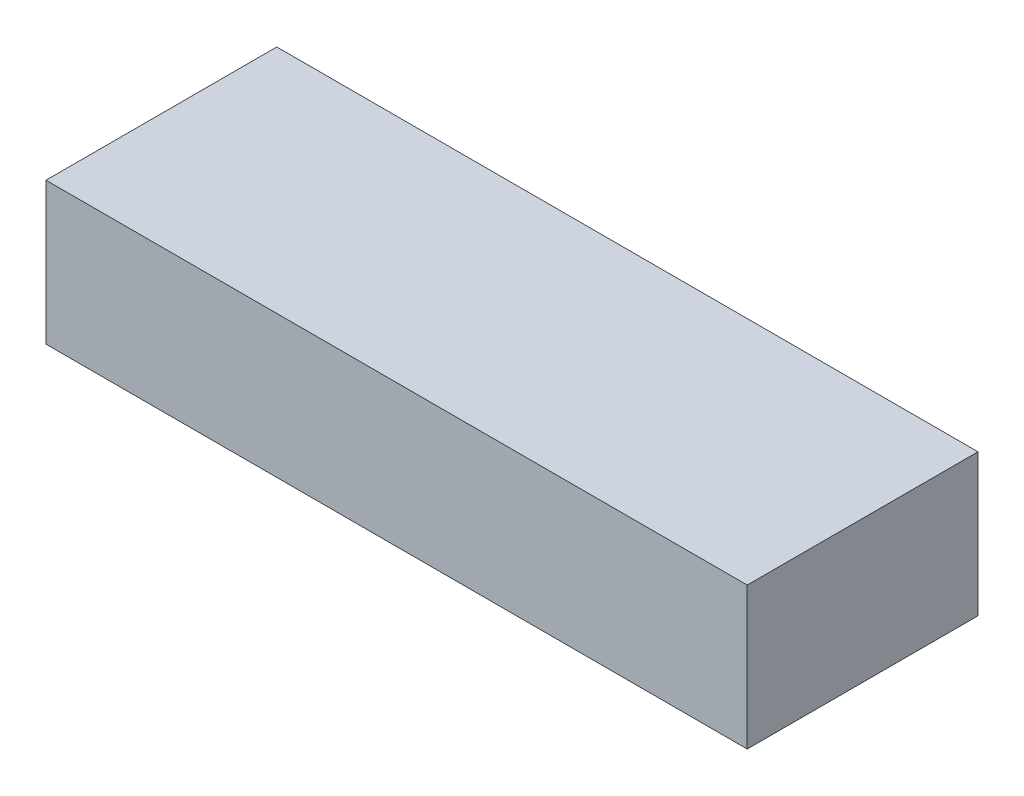
ISO-10303-21;
HEADER;
FILE_DESCRIPTION(('STEP AP214'),'2;1');
FILE_NAME('part.step','',(''),(''),'','','');
FILE_SCHEMA(('AUTOMOTIVE_DESIGN { 1 0 10303 214 1 1 1 1 }'));
ENDSEC;
DATA;
#1=APPLICATION_CONTEXT('core data for automotive mechanical design processes');
#2=APPLICATION_PROTOCOL_DEFINITION('international standard','automotive_design',2000,#1);
#3=PRODUCT_CONTEXT('',#1,'mechanical');
#4=PRODUCT('Part','Part','',(#3));
#5=PRODUCT_RELATED_PRODUCT_CATEGORY('part','',(#4));
#6=PRODUCT_DEFINITION_FORMATION('','',#4);
#7=PRODUCT_DEFINITION_CONTEXT('part definition',#1,'design');
#8=PRODUCT_DEFINITION('design','',#6,#7);
#9=PRODUCT_DEFINITION_SHAPE('','',#8);
#10=(LENGTH_UNIT() NAMED_UNIT(*) SI_UNIT(.MILLI.,.METRE.));
#11=(NAMED_UNIT(*) PLANE_ANGLE_UNIT() SI_UNIT($,.RADIAN.));
#12=(NAMED_UNIT(*) SI_UNIT($,.STERADIAN.) SOLID_ANGLE_UNIT());
#13=UNCERTAINTY_MEASURE_WITH_UNIT(LENGTH_MEASURE(1.E-05),#10,'distance_accuracy_value','');
#14=(GEOMETRIC_REPRESENTATION_CONTEXT(3) GLOBAL_UNCERTAINTY_ASSIGNED_CONTEXT((#13)) GLOBAL_UNIT_ASSIGNED_CONTEXT((#10,
#11,#12)) REPRESENTATION_CONTEXT('',''));
#15=CARTESIAN_POINT('',(0.,0.,0.));
#16=DIRECTION('',(0.,0.,1.));
#17=DIRECTION('',(1.,0.,0.));
#18=AXIS2_PLACEMENT_3D('',#15,#16,#17);
#19=CARTESIAN_POINT('',(118.5,48.,39.));
#20=DIRECTION('',(-1.,0.,0.));
#21=DIRECTION('',(0.,0.,1.));
#22=AXIS2_PLACEMENT_3D('',#19,#20,#21);
#23=PLANE('',#22);
#24=DIRECTION('',(0.,0.,-1.));
#25=VECTOR('',#24,1.);
#26=CARTESIAN_POINT('',(118.5,0.,39.));
#27=LINE('',#26,#25);
#28=CARTESIAN_POINT('',(118.5,0.,39.));
#29=VERTEX_POINT('',#28);
#30=CARTESIAN_POINT('',(118.5,0.,-39.));
#31=VERTEX_POINT('',#30);
#32=EDGE_CURVE('E98',#29,#31,#27,.T.);
#33=ORIENTED_EDGE('',*,*,#32,.T.);
#34=DIRECTION('',(0.,-1.,0.));
#35=VECTOR('',#34,1.);
#36=CARTESIAN_POINT('',(118.5,48.,-39.));
#37=LINE('',#36,#35);
#38=CARTESIAN_POINT('',(118.5,48.,-39.));
#39=VERTEX_POINT('',#38);
#40=EDGE_CURVE('E11',#39,#31,#37,.T.);
#41=ORIENTED_EDGE('',*,*,#40,.F.);
#42=DIRECTION('',(0.,0.,-1.));
#43=VECTOR('',#42,1.);
#44=CARTESIAN_POINT('',(118.5,48.,39.));
#45=LINE('',#44,#43);
#46=CARTESIAN_POINT('',(118.5,48.,39.));
#47=VERTEX_POINT('',#46);
#48=EDGE_CURVE('E86',#47,#39,#45,.T.);
#49=ORIENTED_EDGE('',*,*,#48,.F.);
#50=DIRECTION('',(0.,-1.,0.));
#51=VECTOR('',#50,1.);
#52=CARTESIAN_POINT('',(118.5,48.,39.));
#53=LINE('',#52,#51);
#54=EDGE_CURVE('E94',#47,#29,#53,.T.);
#55=ORIENTED_EDGE('',*,*,#54,.T.);
#56=EDGE_LOOP('',(#33,#41,#49,#55));
#57=FACE_BOUND('',#56,.T.);
#58=ADVANCED_FACE('F35',(#57),#23,.F.);
#59=CARTESIAN_POINT('',(-118.5,48.,-39.));
#60=DIRECTION('',(0.,0.,1.));
#61=DIRECTION('',(1.,0.,0.));
#62=AXIS2_PLACEMENT_3D('',#59,#60,#61);
#63=PLANE('',#62);
#64=DIRECTION('',(-1.,0.,0.));
#65=VECTOR('',#64,1.);
#66=CARTESIAN_POINT('',(-118.5,0.,-39.));
#67=LINE('',#66,#65);
#68=CARTESIAN_POINT('',(-118.5,0.,-39.));
#69=VERTEX_POINT('',#68);
#70=EDGE_CURVE('E90',#31,#69,#67,.T.);
#71=ORIENTED_EDGE('',*,*,#70,.T.);
#72=DIRECTION('',(0.,-1.,0.));
#73=VECTOR('',#72,1.);
#74=CARTESIAN_POINT('',(-118.5,48.,-39.));
#75=LINE('',#74,#73);
#76=CARTESIAN_POINT('',(-118.5,48.,-39.));
#77=VERTEX_POINT('',#76);
#78=EDGE_CURVE('E43',#77,#69,#75,.T.);
#79=ORIENTED_EDGE('',*,*,#78,.F.);
#80=DIRECTION('',(-1.,0.,0.));
#81=VECTOR('',#80,1.);
#82=CARTESIAN_POINT('',(-118.5,48.,-39.));
#83=LINE('',#82,#81);
#84=EDGE_CURVE('E81',#39,#77,#83,.T.);
#85=ORIENTED_EDGE('',*,*,#84,.F.);
#86=ORIENTED_EDGE('',*,*,#40,.T.);
#87=EDGE_LOOP('',(#71,#79,#85,#86));
#88=FACE_BOUND('',#87,.T.);
#89=ADVANCED_FACE('F89',(#88),#63,.F.);
#90=CARTESIAN_POINT('',(-118.5,48.,39.));
#91=DIRECTION('',(1.,0.,0.));
#92=DIRECTION('',(0.,0.,-1.));
#93=AXIS2_PLACEMENT_3D('',#90,#91,#92);
#94=PLANE('',#93);
#95=DIRECTION('',(0.,0.,1.));
#96=VECTOR('',#95,1.);
#97=CARTESIAN_POINT('',(-118.5,0.,39.));
#98=LINE('',#97,#96);
#99=CARTESIAN_POINT('',(-118.5,0.,39.));
#100=VERTEX_POINT('',#99);
#101=EDGE_CURVE('E68',#69,#100,#98,.T.);
#102=ORIENTED_EDGE('',*,*,#101,.T.);
#103=DIRECTION('',(0.,-1.,0.));
#104=VECTOR('',#103,1.);
#105=CARTESIAN_POINT('',(-118.5,48.,39.));
#106=LINE('',#105,#104);
#107=CARTESIAN_POINT('',(-118.5,48.,39.));
#108=VERTEX_POINT('',#107);
#109=EDGE_CURVE('E91',#108,#100,#106,.T.);
#110=ORIENTED_EDGE('',*,*,#109,.F.);
#111=DIRECTION('',(0.,0.,1.));
#112=VECTOR('',#111,1.);
#113=CARTESIAN_POINT('',(-118.5,48.,39.));
#114=LINE('',#113,#112);
#115=EDGE_CURVE('E84',#77,#108,#114,.T.);
#116=ORIENTED_EDGE('',*,*,#115,.F.);
#117=ORIENTED_EDGE('',*,*,#78,.T.);
#118=EDGE_LOOP('',(#102,#110,#116,#117));
#119=FACE_BOUND('',#118,.T.);
#120=ADVANCED_FACE('F92',(#119),#94,.F.);
#121=CARTESIAN_POINT('',(-118.5,48.,39.));
#122=DIRECTION('',(0.,0.,-1.));
#123=DIRECTION('',(-1.,0.,0.));
#124=AXIS2_PLACEMENT_3D('',#121,#122,#123);
#125=PLANE('',#124);
#126=DIRECTION('',(1.,0.,0.));
#127=VECTOR('',#126,1.);
#128=CARTESIAN_POINT('',(-118.5,0.,39.));
#129=LINE('',#128,#127);
#130=EDGE_CURVE('E74',#100,#29,#129,.T.);
#131=ORIENTED_EDGE('',*,*,#130,.T.);
#132=ORIENTED_EDGE('',*,*,#54,.F.);
#133=DIRECTION('',(1.,0.,0.));
#134=VECTOR('',#133,1.);
#135=CARTESIAN_POINT('',(-118.5,48.,39.));
#136=LINE('',#135,#134);
#137=EDGE_CURVE('E51',#108,#47,#136,.T.);
#138=ORIENTED_EDGE('',*,*,#137,.F.);
#139=ORIENTED_EDGE('',*,*,#109,.T.);
#140=EDGE_LOOP('',(#131,#132,#138,#139));
#141=FACE_BOUND('',#140,.T.);
#142=ADVANCED_FACE('F105',(#141),#125,.F.);
#143=CARTESIAN_POINT('',(0.,48.,0.));
#144=DIRECTION('',(0.,-1.,0.));
#145=DIRECTION('',(0.,0.,-1.));
#146=AXIS2_PLACEMENT_3D('',#143,#144,#145);
#147=PLANE('',#146);
#148=ORIENTED_EDGE('',*,*,#48,.T.);
#149=ORIENTED_EDGE('',*,*,#84,.T.);
#150=ORIENTED_EDGE('',*,*,#115,.T.);
#151=ORIENTED_EDGE('',*,*,#137,.T.);
#152=EDGE_LOOP('',(#148,#149,#150,#151));
#153=FACE_BOUND('',#152,.T.);
#154=ADVANCED_FACE('F82',(#153),#147,.F.);
#155=CARTESIAN_POINT('',(0.,0.,0.));
#156=DIRECTION('',(0.,-1.,0.));
#157=DIRECTION('',(0.,0.,-1.));
#158=AXIS2_PLACEMENT_3D('',#155,#156,#157);
#159=PLANE('',#158);
#160=ORIENTED_EDGE('',*,*,#32,.F.);
#161=ORIENTED_EDGE('',*,*,#130,.F.);
#162=ORIENTED_EDGE('',*,*,#101,.F.);
#163=ORIENTED_EDGE('',*,*,#70,.F.);
#164=EDGE_LOOP('',(#160,#161,#162,#163));
#165=FACE_BOUND('',#164,.T.);
#166=ADVANCED_FACE('F108',(#165),#159,.T.);
#167=CLOSED_SHELL('',(#58,#89,#120,#142,#154,#166));
#168=MANIFOLD_SOLID_BREP('B2',#167);
#169=ADVANCED_BREP_SHAPE_REPRESENTATION('',(#18,#168),#14);
#170=SHAPE_DEFINITION_REPRESENTATION(#9,#169);
ENDSEC;
END-ISO-10303-21;
